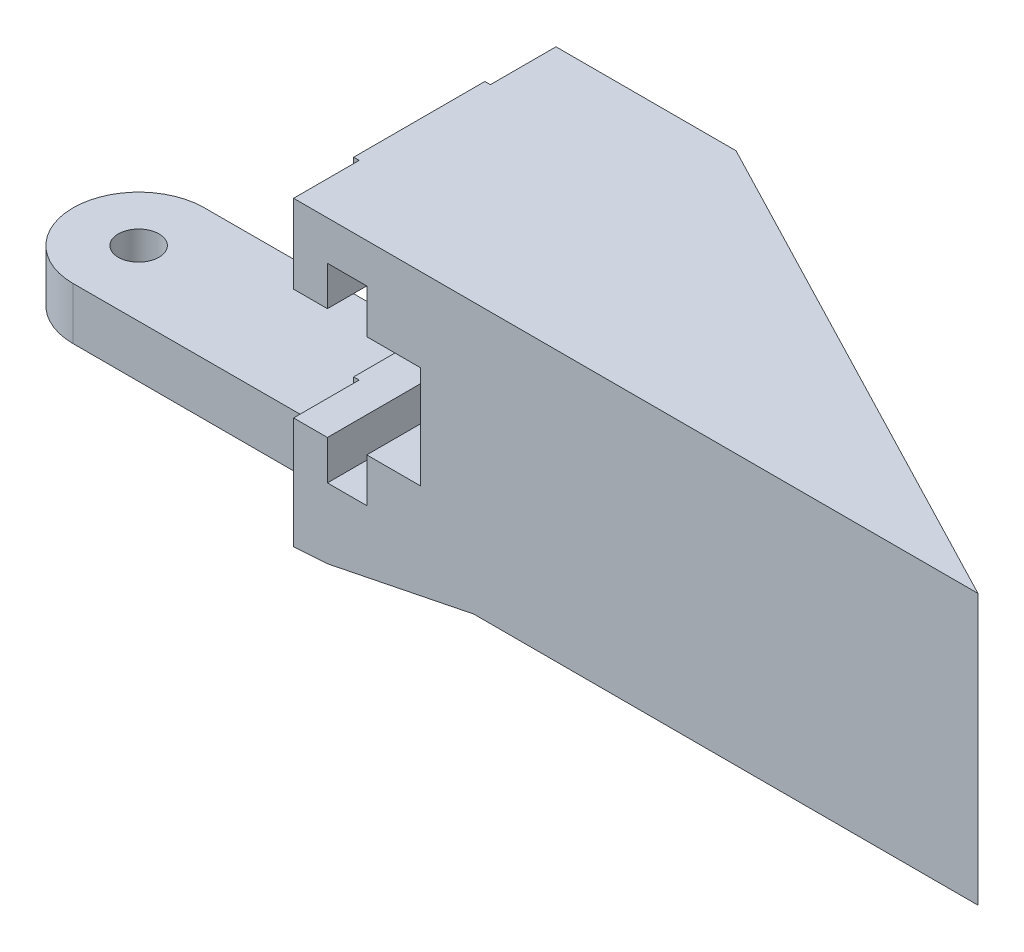
ISO-10303-21;
HEADER;
FILE_DESCRIPTION(('STEP AP214'),'2;1');
FILE_NAME('part.step','',(''),(''),'','','');
FILE_SCHEMA(('AUTOMOTIVE_DESIGN { 1 0 10303 214 1 1 1 1 }'));
ENDSEC;
DATA;
#1=APPLICATION_CONTEXT('core data for automotive mechanical design processes');
#2=APPLICATION_PROTOCOL_DEFINITION('international standard','automotive_design',2000,#1);
#3=PRODUCT_CONTEXT('',#1,'mechanical');
#4=PRODUCT('Part','Part','',(#3));
#5=PRODUCT_RELATED_PRODUCT_CATEGORY('part','',(#4));
#6=PRODUCT_DEFINITION_FORMATION('','',#4);
#7=PRODUCT_DEFINITION_CONTEXT('part definition',#1,'design');
#8=PRODUCT_DEFINITION('design','',#6,#7);
#9=PRODUCT_DEFINITION_SHAPE('','',#8);
#10=(LENGTH_UNIT() NAMED_UNIT(*) SI_UNIT(.MILLI.,.METRE.));
#11=(NAMED_UNIT(*) PLANE_ANGLE_UNIT() SI_UNIT($,.RADIAN.));
#12=(NAMED_UNIT(*) SI_UNIT($,.STERADIAN.) SOLID_ANGLE_UNIT());
#13=UNCERTAINTY_MEASURE_WITH_UNIT(LENGTH_MEASURE(1.E-05),#10,'distance_accuracy_value','');
#14=(GEOMETRIC_REPRESENTATION_CONTEXT(3) GLOBAL_UNCERTAINTY_ASSIGNED_CONTEXT((#13)) GLOBAL_UNIT_ASSIGNED_CONTEXT((#10,
#11,#12)) REPRESENTATION_CONTEXT('',''));
#15=CARTESIAN_POINT('',(0.,0.,0.));
#16=DIRECTION('',(0.,0.,1.));
#17=DIRECTION('',(1.,0.,0.));
#18=AXIS2_PLACEMENT_3D('',#15,#16,#17);
#19=CARTESIAN_POINT('',(-39.49001324769,-7.53608306718795,20.));
#20=DIRECTION('',(0.00136731456757834,-0.999999065225,0.));
#21=DIRECTION('',(0.999999065225,0.00136731456757834,0.));
#22=AXIS2_PLACEMENT_3D('',#19,#20,#21);
#23=PLANE('',#22);
#24=CARTESIAN_POINT('',(-34.49001324769,-7.5292464879594,10.));
#25=DIRECTION('',(0.00136731456757834,-0.999999065225,0.));
#26=DIRECTION('',(-0.999999065225,-0.00136731456757834,0.));
#27=AXIS2_PLACEMENT_3D('',#24,#25,#26);
#28=ELLIPSE('',#27,1.55000144890261,1.55);
#29=CARTESIAN_POINT('',(-36.04001324769,-7.53136582752025,10.));
#30=VERTEX_POINT('',#29);
#31=EDGE_CURVE('E281',#30,#30,#28,.T.);
#32=ORIENTED_EDGE('',*,*,#31,.T.);
#33=EDGE_LOOP('',(#32));
#34=FACE_BOUND('',#33,.T.);
#35=DIRECTION('',(-0.999999065225,-0.00136731456757834,0.));
#36=VECTOR('',#35,1.);
#37=CARTESIAN_POINT('',(-39.49001324769,-7.53608306718795,5.));
#38=LINE('',#37,#36);
#39=CARTESIAN_POINT('',(-13.1003043144092,-7.49999999999978,5.));
#40=VERTEX_POINT('',#39);
#41=CARTESIAN_POINT('',(-34.49001324769,-7.52924648795939,5.));
#42=VERTEX_POINT('',#41);
#43=EDGE_CURVE('E291',#40,#42,#38,.T.);
#44=ORIENTED_EDGE('',*,*,#43,.T.);
#45=CARTESIAN_POINT('',(-34.49001324769,-7.5292464879594,10.));
#46=DIRECTION('',(0.00136731456757834,-0.999999065225,0.));
#47=DIRECTION('',(-0.999999065225,-0.00136731456757834,0.));
#48=AXIS2_PLACEMENT_3D('',#45,#46,#47);
#49=ELLIPSE('',#48,5.00000467387937,5.);
#50=CARTESIAN_POINT('',(-34.49001324769,-7.52924648795939,15.));
#51=VERTEX_POINT('',#50);
#52=EDGE_CURVE('E270',#51,#42,#49,.T.);
#53=ORIENTED_EDGE('',*,*,#52,.F.);
#54=DIRECTION('',(0.999999065225,0.00136731456757834,0.));
#55=VECTOR('',#54,1.);
#56=CARTESIAN_POINT('',(-39.49001324769,-7.53608306718795,15.));
#57=LINE('',#56,#55);
#58=CARTESIAN_POINT('',(-13.1003043144092,-7.49999999999978,15.));
#59=VERTEX_POINT('',#58);
#60=EDGE_CURVE('E320',#51,#59,#57,.T.);
#61=ORIENTED_EDGE('',*,*,#60,.T.);
#62=DIRECTION('',(0.,0.,-1.));
#63=VECTOR('',#62,1.);
#64=CARTESIAN_POINT('',(-13.1003043144092,-7.49999999999978,20.));
#65=LINE('',#64,#63);
#66=EDGE_CURVE('E475',#59,#40,#65,.T.);
#67=ORIENTED_EDGE('',*,*,#66,.T.);
#68=EDGE_LOOP('',(#44,#53,#61,#67));
#69=FACE_BOUND('',#68,.T.);
#70=ADVANCED_FACE('F87',(#34,#69),#23,.F.);
#71=CARTESIAN_POINT('',(-12.6786659876891,-11.5000000000002,20.));
#72=DIRECTION('',(0.,1.,0.));
#73=DIRECTION('',(0.,0.,1.));
#74=AXIS2_PLACEMENT_3D('',#71,#72,#73);
#75=PLANE('',#74);
#76=CARTESIAN_POINT('',(-34.49001324769,-11.5000000000002,10.));
#77=DIRECTION('',(0.,1.,0.));
#78=DIRECTION('',(0.,0.,1.));
#79=AXIS2_PLACEMENT_3D('',#76,#77,#78);
#80=CIRCLE('',#79,1.55);
#81=CARTESIAN_POINT('',(-34.49001324769,-11.5000000000002,11.55));
#82=VERTEX_POINT('',#81);
#83=EDGE_CURVE('E535',#82,#82,#80,.T.);
#84=ORIENTED_EDGE('',*,*,#83,.T.);
#85=EDGE_LOOP('',(#84));
#86=FACE_BOUND('',#85,.T.);
#87=CARTESIAN_POINT('',(-34.49001324769,-11.5000000000002,10.));
#88=DIRECTION('',(0.,-1.,0.));
#89=DIRECTION('',(0.,0.,-1.));
#90=AXIS2_PLACEMENT_3D('',#87,#88,#89);
#91=CIRCLE('',#90,5.);
#92=CARTESIAN_POINT('',(-34.49001324769,-11.5000000000002,15.));
#93=VERTEX_POINT('',#92);
#94=CARTESIAN_POINT('',(-34.49001324769,-11.5000000000002,5.));
#95=VERTEX_POINT('',#94);
#96=EDGE_CURVE('E91',#93,#95,#91,.T.);
#97=ORIENTED_EDGE('',*,*,#96,.T.);
#98=DIRECTION('',(1.,0.,0.));
#99=VECTOR('',#98,1.);
#100=CARTESIAN_POINT('',(-12.6786659876891,-11.5000000000002,5.));
#101=LINE('',#100,#99);
#102=CARTESIAN_POINT('',(-12.6786659876891,-11.5000000000002,5.));
#103=VERTEX_POINT('',#102);
#104=EDGE_CURVE('E277',#95,#103,#101,.T.);
#105=ORIENTED_EDGE('',*,*,#104,.T.);
#106=DIRECTION('',(0.,0.,-1.));
#107=VECTOR('',#106,1.);
#108=CARTESIAN_POINT('',(-12.6786659876891,-11.5000000000002,20.));
#109=LINE('',#108,#107);
#110=CARTESIAN_POINT('',(-12.6786659876891,-11.5000000000002,15.));
#111=VERTEX_POINT('',#110);
#112=EDGE_CURVE('E470',#111,#103,#109,.T.);
#113=ORIENTED_EDGE('',*,*,#112,.F.);
#114=DIRECTION('',(-1.,0.,0.));
#115=VECTOR('',#114,1.);
#116=CARTESIAN_POINT('',(-12.6786659876891,-11.5000000000002,15.));
#117=LINE('',#116,#115);
#118=EDGE_CURVE('E279',#111,#93,#117,.T.);
#119=ORIENTED_EDGE('',*,*,#118,.T.);
#120=EDGE_LOOP('',(#97,#105,#113,#119));
#121=FACE_BOUND('',#120,.T.);
#122=ADVANCED_FACE('F274',(#86,#121),#75,.F.);
#123=CARTESIAN_POINT('',(-12.6786659876891,11.5000000000002,5.));
#124=DIRECTION('',(0.,0.,1.));
#125=DIRECTION('',(1.,0.,0.));
#126=AXIS2_PLACEMENT_3D('',#123,#124,#125);
#127=PLANE('',#126);
#128=DIRECTION('',(0.,-1.,0.));
#129=VECTOR('',#128,1.);
#130=CARTESIAN_POINT('',(-34.49001324769,11.5000000000002,5.));
#131=LINE('',#130,#129);
#132=EDGE_CURVE('E12',#42,#95,#131,.T.);
#133=ORIENTED_EDGE('',*,*,#132,.F.);
#134=ORIENTED_EDGE('',*,*,#43,.F.);
#135=DIRECTION('',(0.,-1.,0.));
#136=VECTOR('',#135,1.);
#137=CARTESIAN_POINT('',(-13.1003043144092,-7.49999999999978,5.));
#138=LINE('',#137,#136);
#139=CARTESIAN_POINT('',(-13.1003043144092,-2.99999999999977,5.));
#140=VERTEX_POINT('',#139);
#141=EDGE_CURVE('E296',#140,#40,#138,.T.);
#142=ORIENTED_EDGE('',*,*,#141,.F.);
#143=DIRECTION('',(-1.,0.,0.));
#144=VECTOR('',#143,1.);
#145=CARTESIAN_POINT('',(-13.1003043144092,-2.99999999999977,5.));
#146=LINE('',#145,#144);
#147=CARTESIAN_POINT('',(-12.6786659876891,-2.99999999999976,5.));
#148=VERTEX_POINT('',#147);
#149=EDGE_CURVE('E306',#148,#140,#146,.T.);
#150=ORIENTED_EDGE('',*,*,#149,.F.);
#151=DIRECTION('',(0.,-1.,0.));
#152=VECTOR('',#151,1.);
#153=CARTESIAN_POINT('',(-12.6786659876891,11.5000000000002,5.));
#154=LINE('',#153,#152);
#155=EDGE_CURVE('E288',#148,#103,#154,.T.);
#156=ORIENTED_EDGE('',*,*,#155,.T.);
#157=ORIENTED_EDGE('',*,*,#104,.F.);
#158=EDGE_LOOP('',(#133,#134,#142,#150,#156,#157));
#159=FACE_BOUND('',#158,.T.);
#160=ADVANCED_FACE('F286',(#159),#127,.F.);
#161=CARTESIAN_POINT('',(-13.1003043144223,5.50000000000023,20.));
#162=DIRECTION('',(1.,0.,0.));
#163=DIRECTION('',(0.,0.,-1.));
#164=AXIS2_PLACEMENT_3D('',#161,#162,#163);
#165=PLANE('',#164);
#166=DIRECTION('',(0.,0.,-1.));
#167=VECTOR('',#166,1.);
#168=CARTESIAN_POINT('',(-13.1003043144223,5.50000000000023,20.));
#169=LINE('',#168,#167);
#170=CARTESIAN_POINT('',(-13.1003043144223,5.50000000000023,15.));
#171=VERTEX_POINT('',#170);
#172=CARTESIAN_POINT('',(-13.1003043144223,5.50000000000023,5.));
#173=VERTEX_POINT('',#172);
#174=EDGE_CURVE('E523',#171,#173,#169,.T.);
#175=ORIENTED_EDGE('',*,*,#174,.F.);
#176=DIRECTION('',(0.,1.,0.));
#177=VECTOR('',#176,1.);
#178=CARTESIAN_POINT('',(-13.1003043144223,5.50000000000023,15.));
#179=LINE('',#178,#177);
#180=CARTESIAN_POINT('',(-13.1003043144223,11.5000000000002,15.));
#181=VERTEX_POINT('',#180);
#182=EDGE_CURVE('E335',#171,#181,#179,.T.);
#183=ORIENTED_EDGE('',*,*,#182,.T.);
#184=DIRECTION('',(0.,0.,-1.));
#185=VECTOR('',#184,1.);
#186=CARTESIAN_POINT('',(-13.1003043144223,11.5000000000002,20.));
#187=LINE('',#186,#185);
#188=CARTESIAN_POINT('',(-13.1003043144223,11.5000000000002,5.));
#189=VERTEX_POINT('',#188);
#190=EDGE_CURVE('E408',#181,#189,#187,.T.);
#191=ORIENTED_EDGE('',*,*,#190,.T.);
#192=DIRECTION('',(0.,-1.,0.));
#193=VECTOR('',#192,1.);
#194=CARTESIAN_POINT('',(-13.1003043144223,5.50000000000023,5.));
#195=LINE('',#194,#193);
#196=EDGE_CURVE('E314',#189,#173,#195,.T.);
#197=ORIENTED_EDGE('',*,*,#196,.T.);
#198=EDGE_LOOP('',(#175,#183,#191,#197));
#199=FACE_BOUND('',#198,.T.);
#200=ADVANCED_FACE('F89',(#199),#165,.F.);
#201=CARTESIAN_POINT('',(-10.1003043144092,5.50000000000023,20.));
#202=DIRECTION('',(0.,1.,0.));
#203=DIRECTION('',(0.,0.,1.));
#204=AXIS2_PLACEMENT_3D('',#201,#202,#203);
#205=PLANE('',#204);
#206=DIRECTION('',(1.,0.,0.));
#207=VECTOR('',#206,1.);
#208=CARTESIAN_POINT('',(-10.1003043144092,5.50000000000023,20.));
#209=LINE('',#208,#207);
#210=CARTESIAN_POINT('',(-12.6786659876891,5.50000000000023,20.));
#211=VERTEX_POINT('',#210);
#212=CARTESIAN_POINT('',(-10.1003043144092,5.50000000000023,20.));
#213=VERTEX_POINT('',#212);
#214=EDGE_CURVE('E352',#211,#213,#209,.T.);
#215=ORIENTED_EDGE('',*,*,#214,.F.);
#216=DIRECTION('',(0.,0.,-1.));
#217=VECTOR('',#216,1.);
#218=CARTESIAN_POINT('',(-12.6786659876891,5.50000000000023,20.));
#219=LINE('',#218,#217);
#220=CARTESIAN_POINT('',(-12.6786659876891,5.50000000000023,15.));
#221=VERTEX_POINT('',#220);
#222=EDGE_CURVE('E292',#211,#221,#219,.T.);
#223=ORIENTED_EDGE('',*,*,#222,.T.);
#224=DIRECTION('',(-1.,0.,0.));
#225=VECTOR('',#224,1.);
#226=CARTESIAN_POINT('',(-10.1003043144092,5.50000000000023,15.));
#227=LINE('',#226,#225);
#228=EDGE_CURVE('E331',#221,#171,#227,.T.);
#229=ORIENTED_EDGE('',*,*,#228,.T.);
#230=ORIENTED_EDGE('',*,*,#174,.T.);
#231=DIRECTION('',(1.,0.,0.));
#232=VECTOR('',#231,1.);
#233=CARTESIAN_POINT('',(-10.1003043144092,5.50000000000023,5.));
#234=LINE('',#233,#232);
#235=CARTESIAN_POINT('',(-12.6786659876891,5.50000000000023,5.));
#236=VERTEX_POINT('',#235);
#237=EDGE_CURVE('E310',#173,#236,#234,.T.);
#238=ORIENTED_EDGE('',*,*,#237,.T.);
#239=DIRECTION('',(0.,0.,-1.));
#240=VECTOR('',#239,1.);
#241=CARTESIAN_POINT('',(-12.6786659876891,5.50000000000023,20.));
#242=LINE('',#241,#240);
#243=CARTESIAN_POINT('',(-12.6786659876891,5.50000000000023,0.));
#244=VERTEX_POINT('',#243);
#245=EDGE_CURVE('E588',#236,#244,#242,.T.);
#246=ORIENTED_EDGE('',*,*,#245,.T.);
#247=DIRECTION('',(1.,0.,0.));
#248=VECTOR('',#247,1.);
#249=CARTESIAN_POINT('',(-10.1003043144092,5.50000000000023,0.));
#250=LINE('',#249,#248);
#251=CARTESIAN_POINT('',(-10.1003043144092,5.50000000000023,0.));
#252=VERTEX_POINT('',#251);
#253=EDGE_CURVE('E351',#244,#252,#250,.T.);
#254=ORIENTED_EDGE('',*,*,#253,.T.);
#255=DIRECTION('',(0.,0.,-1.));
#256=VECTOR('',#255,1.);
#257=CARTESIAN_POINT('',(-10.1003043144092,5.50000000000023,20.));
#258=LINE('',#257,#256);
#259=EDGE_CURVE('E519',#213,#252,#258,.T.);
#260=ORIENTED_EDGE('',*,*,#259,.F.);
#261=EDGE_LOOP('',(#215,#223,#229,#230,#238,#246,#254,#260));
#262=FACE_BOUND('',#261,.T.);
#263=ADVANCED_FACE('F785',(#262),#205,.F.);
#264=CARTESIAN_POINT('',(-10.1003043144092,8.50000000000023,20.));
#265=DIRECTION('',(-1.,0.,0.));
#266=DIRECTION('',(0.,0.,1.));
#267=AXIS2_PLACEMENT_3D('',#264,#265,#266);
#268=PLANE('',#267);
#269=DIRECTION('',(0.,1.,0.));
#270=VECTOR('',#269,1.);
#271=CARTESIAN_POINT('',(-10.1003043144092,8.50000000000023,0.));
#272=LINE('',#271,#270);
#273=CARTESIAN_POINT('',(-10.1003043144092,8.50000000000023,0.));
#274=VERTEX_POINT('',#273);
#275=EDGE_CURVE('E411',#252,#274,#272,.T.);
#276=ORIENTED_EDGE('',*,*,#275,.T.);
#277=DIRECTION('',(0.,0.,-1.));
#278=VECTOR('',#277,1.);
#279=CARTESIAN_POINT('',(-10.1003043144092,8.50000000000023,20.));
#280=LINE('',#279,#278);
#281=CARTESIAN_POINT('',(-10.1003043144092,8.50000000000023,20.));
#282=VERTEX_POINT('',#281);
#283=EDGE_CURVE('E515',#282,#274,#280,.T.);
#284=ORIENTED_EDGE('',*,*,#283,.F.);
#285=DIRECTION('',(0.,1.,0.));
#286=VECTOR('',#285,1.);
#287=CARTESIAN_POINT('',(-10.1003043144092,8.50000000000023,20.));
#288=LINE('',#287,#286);
#289=EDGE_CURVE('E355',#213,#282,#288,.T.);
#290=ORIENTED_EDGE('',*,*,#289,.F.);
#291=ORIENTED_EDGE('',*,*,#259,.T.);
#292=EDGE_LOOP('',(#276,#284,#290,#291));
#293=FACE_BOUND('',#292,.T.);
#294=ADVANCED_FACE('F789',(#293),#268,.F.);
#295=CARTESIAN_POINT('',(-7.10030431440922,8.50000000000023,20.));
#296=DIRECTION('',(0.,1.,0.));
#297=DIRECTION('',(0.,0.,1.));
#298=AXIS2_PLACEMENT_3D('',#295,#296,#297);
#299=PLANE('',#298);
#300=DIRECTION('',(1.,0.,0.));
#301=VECTOR('',#300,1.);
#302=CARTESIAN_POINT('',(-7.10030431440922,8.50000000000023,0.));
#303=LINE('',#302,#301);
#304=CARTESIAN_POINT('',(-7.10030431440922,8.50000000000023,0.));
#305=VERTEX_POINT('',#304);
#306=EDGE_CURVE('E414',#274,#305,#303,.T.);
#307=ORIENTED_EDGE('',*,*,#306,.T.);
#308=DIRECTION('',(0.,0.,-1.));
#309=VECTOR('',#308,1.);
#310=CARTESIAN_POINT('',(-7.10030431440922,8.50000000000023,20.));
#311=LINE('',#310,#309);
#312=CARTESIAN_POINT('',(-7.10030431440922,8.50000000000023,20.));
#313=VERTEX_POINT('',#312);
#314=EDGE_CURVE('E511',#313,#305,#311,.T.);
#315=ORIENTED_EDGE('',*,*,#314,.F.);
#316=DIRECTION('',(1.,0.,0.));
#317=VECTOR('',#316,1.);
#318=CARTESIAN_POINT('',(-7.10030431440922,8.50000000000023,20.));
#319=LINE('',#318,#317);
#320=EDGE_CURVE('E359',#282,#313,#319,.T.);
#321=ORIENTED_EDGE('',*,*,#320,.F.);
#322=ORIENTED_EDGE('',*,*,#283,.T.);
#323=EDGE_LOOP('',(#307,#315,#321,#322));
#324=FACE_BOUND('',#323,.T.);
#325=ADVANCED_FACE('F871',(#324),#299,.F.);
#326=CARTESIAN_POINT('',(-7.10030431440922,5.15000000000023,20.));
#327=DIRECTION('',(1.,0.,0.));
#328=DIRECTION('',(0.,0.,-1.));
#329=AXIS2_PLACEMENT_3D('',#326,#327,#328);
#330=PLANE('',#329);
#331=DIRECTION('',(0.,-1.,0.));
#332=VECTOR('',#331,1.);
#333=CARTESIAN_POINT('',(-7.10030431440922,5.15000000000023,0.));
#334=LINE('',#333,#332);
#335=CARTESIAN_POINT('',(-7.10030431440922,5.15000000000023,0.));
#336=VERTEX_POINT('',#335);
#337=EDGE_CURVE('E417',#305,#336,#334,.T.);
#338=ORIENTED_EDGE('',*,*,#337,.T.);
#339=DIRECTION('',(0.,0.,-1.));
#340=VECTOR('',#339,1.);
#341=CARTESIAN_POINT('',(-7.10030431440922,5.15000000000023,20.));
#342=LINE('',#341,#340);
#343=CARTESIAN_POINT('',(-7.10030431440922,5.15000000000023,20.));
#344=VERTEX_POINT('',#343);
#345=EDGE_CURVE('E507',#344,#336,#342,.T.);
#346=ORIENTED_EDGE('',*,*,#345,.F.);
#347=DIRECTION('',(0.,-1.,0.));
#348=VECTOR('',#347,1.);
#349=CARTESIAN_POINT('',(-7.10030431440922,5.15000000000023,20.));
#350=LINE('',#349,#348);
#351=EDGE_CURVE('E362',#313,#344,#350,.T.);
#352=ORIENTED_EDGE('',*,*,#351,.F.);
#353=ORIENTED_EDGE('',*,*,#314,.T.);
#354=EDGE_LOOP('',(#338,#346,#352,#353));
#355=FACE_BOUND('',#354,.T.);
#356=ADVANCED_FACE('F884',(#355),#330,.F.);
#357=CARTESIAN_POINT('',(-3.00030431440922,5.15000000000023,20.));
#358=DIRECTION('',(0.,1.,0.));
#359=DIRECTION('',(0.,0.,1.));
#360=AXIS2_PLACEMENT_3D('',#357,#358,#359);
#361=PLANE('',#360);
#362=DIRECTION('',(1.,0.,0.));
#363=VECTOR('',#362,1.);
#364=CARTESIAN_POINT('',(-3.00030431440922,5.15000000000023,0.));
#365=LINE('',#364,#363);
#366=CARTESIAN_POINT('',(-3.00030431440922,5.15000000000023,0.));
#367=VERTEX_POINT('',#366);
#368=EDGE_CURVE('E420',#336,#367,#365,.T.);
#369=ORIENTED_EDGE('',*,*,#368,.T.);
#370=DIRECTION('',(0.,0.,-1.));
#371=VECTOR('',#370,1.);
#372=CARTESIAN_POINT('',(-3.00030431440922,5.15000000000023,20.));
#373=LINE('',#372,#371);
#374=CARTESIAN_POINT('',(-3.00030431440922,5.15000000000023,20.));
#375=VERTEX_POINT('',#374);
#376=EDGE_CURVE('E503',#375,#367,#373,.T.);
#377=ORIENTED_EDGE('',*,*,#376,.F.);
#378=DIRECTION('',(1.,0.,0.));
#379=VECTOR('',#378,1.);
#380=CARTESIAN_POINT('',(-3.00030431440922,5.15000000000023,20.));
#381=LINE('',#380,#379);
#382=EDGE_CURVE('E365',#344,#375,#381,.T.);
#383=ORIENTED_EDGE('',*,*,#382,.F.);
#384=ORIENTED_EDGE('',*,*,#345,.T.);
#385=EDGE_LOOP('',(#369,#377,#383,#384));
#386=FACE_BOUND('',#385,.T.);
#387=ADVANCED_FACE('F887',(#386),#361,.F.);
#388=CARTESIAN_POINT('',(-3.00030431440922,-2.64999999999977,20.));
#389=DIRECTION('',(1.,0.,0.));
#390=DIRECTION('',(0.,0.,-1.));
#391=AXIS2_PLACEMENT_3D('',#388,#389,#390);
#392=PLANE('',#391);
#393=DIRECTION('',(0.,-1.,0.));
#394=VECTOR('',#393,1.);
#395=CARTESIAN_POINT('',(-3.00030431440922,-2.64999999999977,0.));
#396=LINE('',#395,#394);
#397=CARTESIAN_POINT('',(-3.00030431440922,-2.64999999999977,0.));
#398=VERTEX_POINT('',#397);
#399=EDGE_CURVE('E423',#367,#398,#396,.T.);
#400=ORIENTED_EDGE('',*,*,#399,.T.);
#401=DIRECTION('',(0.,0.,-1.));
#402=VECTOR('',#401,1.);
#403=CARTESIAN_POINT('',(-3.00030431440922,-2.64999999999977,20.));
#404=LINE('',#403,#402);
#405=CARTESIAN_POINT('',(-3.00030431440922,-2.64999999999977,20.));
#406=VERTEX_POINT('',#405);
#407=EDGE_CURVE('E499',#406,#398,#404,.T.);
#408=ORIENTED_EDGE('',*,*,#407,.F.);
#409=DIRECTION('',(0.,-1.,0.));
#410=VECTOR('',#409,1.);
#411=CARTESIAN_POINT('',(-3.00030431440922,-2.64999999999977,20.));
#412=LINE('',#411,#410);
#413=EDGE_CURVE('E368',#375,#406,#412,.T.);
#414=ORIENTED_EDGE('',*,*,#413,.F.);
#415=ORIENTED_EDGE('',*,*,#376,.T.);
#416=EDGE_LOOP('',(#400,#408,#414,#415));
#417=FACE_BOUND('',#416,.T.);
#418=ADVANCED_FACE('F892',(#417),#392,.F.);
#419=CARTESIAN_POINT('',(-7.10030431440923,-2.64999999999977,20.));
#420=DIRECTION('',(0.,-1.,0.));
#421=DIRECTION('',(0.,0.,-1.));
#422=AXIS2_PLACEMENT_3D('',#419,#420,#421);
#423=PLANE('',#422);
#424=DIRECTION('',(-1.,0.,0.));
#425=VECTOR('',#424,1.);
#426=CARTESIAN_POINT('',(-7.10030431440923,-2.64999999999977,0.));
#427=LINE('',#426,#425);
#428=CARTESIAN_POINT('',(-7.10030431440923,-2.64999999999977,0.));
#429=VERTEX_POINT('',#428);
#430=EDGE_CURVE('E426',#398,#429,#427,.T.);
#431=ORIENTED_EDGE('',*,*,#430,.T.);
#432=DIRECTION('',(0.,0.,-1.));
#433=VECTOR('',#432,1.);
#434=CARTESIAN_POINT('',(-7.10030431440923,-2.64999999999977,20.));
#435=LINE('',#434,#433);
#436=CARTESIAN_POINT('',(-7.10030431440923,-2.64999999999977,20.));
#437=VERTEX_POINT('',#436);
#438=EDGE_CURVE('E495',#437,#429,#435,.T.);
#439=ORIENTED_EDGE('',*,*,#438,.F.);
#440=DIRECTION('',(-1.,0.,0.));
#441=VECTOR('',#440,1.);
#442=CARTESIAN_POINT('',(-7.10030431440923,-2.64999999999977,20.));
#443=LINE('',#442,#441);
#444=EDGE_CURVE('E371',#406,#437,#443,.T.);
#445=ORIENTED_EDGE('',*,*,#444,.F.);
#446=ORIENTED_EDGE('',*,*,#407,.T.);
#447=EDGE_LOOP('',(#431,#439,#445,#446));
#448=FACE_BOUND('',#447,.T.);
#449=ADVANCED_FACE('F898',(#448),#423,.F.);
#450=CARTESIAN_POINT('',(-7.10030431440923,-5.99999999999977,20.));
#451=DIRECTION('',(1.,0.,0.));
#452=DIRECTION('',(0.,0.,-1.));
#453=AXIS2_PLACEMENT_3D('',#450,#451,#452);
#454=PLANE('',#453);
#455=DIRECTION('',(0.,-1.,0.));
#456=VECTOR('',#455,1.);
#457=CARTESIAN_POINT('',(-7.10030431440923,-5.99999999999977,0.));
#458=LINE('',#457,#456);
#459=CARTESIAN_POINT('',(-7.10030431440923,-5.99999999999977,0.));
#460=VERTEX_POINT('',#459);
#461=EDGE_CURVE('E429',#429,#460,#458,.T.);
#462=ORIENTED_EDGE('',*,*,#461,.T.);
#463=DIRECTION('',(0.,0.,-1.));
#464=VECTOR('',#463,1.);
#465=CARTESIAN_POINT('',(-7.10030431440923,-5.99999999999977,20.));
#466=LINE('',#465,#464);
#467=CARTESIAN_POINT('',(-7.10030431440923,-5.99999999999977,20.));
#468=VERTEX_POINT('',#467);
#469=EDGE_CURVE('E491',#468,#460,#466,.T.);
#470=ORIENTED_EDGE('',*,*,#469,.F.);
#471=DIRECTION('',(0.,-1.,0.));
#472=VECTOR('',#471,1.);
#473=CARTESIAN_POINT('',(-7.10030431440923,-5.99999999999977,20.));
#474=LINE('',#473,#472);
#475=EDGE_CURVE('E374',#437,#468,#474,.T.);
#476=ORIENTED_EDGE('',*,*,#475,.F.);
#477=ORIENTED_EDGE('',*,*,#438,.T.);
#478=EDGE_LOOP('',(#462,#470,#476,#477));
#479=FACE_BOUND('',#478,.T.);
#480=ADVANCED_FACE('F902',(#479),#454,.F.);
#481=CARTESIAN_POINT('',(-10.1003043144092,-5.99999999999977,20.));
#482=DIRECTION('',(0.,-1.,0.));
#483=DIRECTION('',(0.,0.,-1.));
#484=AXIS2_PLACEMENT_3D('',#481,#482,#483);
#485=PLANE('',#484);
#486=DIRECTION('',(-1.,0.,0.));
#487=VECTOR('',#486,1.);
#488=CARTESIAN_POINT('',(-10.1003043144092,-5.99999999999977,0.));
#489=LINE('',#488,#487);
#490=CARTESIAN_POINT('',(-10.1003043144092,-5.99999999999977,0.));
#491=VERTEX_POINT('',#490);
#492=EDGE_CURVE('E432',#460,#491,#489,.T.);
#493=ORIENTED_EDGE('',*,*,#492,.T.);
#494=DIRECTION('',(0.,0.,-1.));
#495=VECTOR('',#494,1.);
#496=CARTESIAN_POINT('',(-10.1003043144092,-5.99999999999977,20.));
#497=LINE('',#496,#495);
#498=CARTESIAN_POINT('',(-10.1003043144092,-5.99999999999977,20.));
#499=VERTEX_POINT('',#498);
#500=EDGE_CURVE('E487',#499,#491,#497,.T.);
#501=ORIENTED_EDGE('',*,*,#500,.F.);
#502=DIRECTION('',(-1.,0.,0.));
#503=VECTOR('',#502,1.);
#504=CARTESIAN_POINT('',(-10.1003043144092,-5.99999999999977,20.));
#505=LINE('',#504,#503);
#506=EDGE_CURVE('E377',#468,#499,#505,.T.);
#507=ORIENTED_EDGE('',*,*,#506,.F.);
#508=ORIENTED_EDGE('',*,*,#469,.T.);
#509=EDGE_LOOP('',(#493,#501,#507,#508));
#510=FACE_BOUND('',#509,.T.);
#511=ADVANCED_FACE('F904',(#510),#485,.F.);
#512=CARTESIAN_POINT('',(-10.1003043144092,-2.99999999999977,20.));
#513=DIRECTION('',(-1.,0.,0.));
#514=DIRECTION('',(0.,0.,1.));
#515=AXIS2_PLACEMENT_3D('',#512,#513,#514);
#516=PLANE('',#515);
#517=DIRECTION('',(0.,1.,0.));
#518=VECTOR('',#517,1.);
#519=CARTESIAN_POINT('',(-10.1003043144092,-2.99999999999977,0.));
#520=LINE('',#519,#518);
#521=CARTESIAN_POINT('',(-10.1003043144092,-2.99999999999977,0.));
#522=VERTEX_POINT('',#521);
#523=EDGE_CURVE('E435',#491,#522,#520,.T.);
#524=ORIENTED_EDGE('',*,*,#523,.T.);
#525=DIRECTION('',(0.,0.,-1.));
#526=VECTOR('',#525,1.);
#527=CARTESIAN_POINT('',(-10.1003043144092,-2.99999999999977,20.));
#528=LINE('',#527,#526);
#529=CARTESIAN_POINT('',(-10.1003043144092,-2.99999999999977,20.));
#530=VERTEX_POINT('',#529);
#531=EDGE_CURVE('E483',#530,#522,#528,.T.);
#532=ORIENTED_EDGE('',*,*,#531,.F.);
#533=DIRECTION('',(0.,1.,0.));
#534=VECTOR('',#533,1.);
#535=CARTESIAN_POINT('',(-10.1003043144092,-2.99999999999977,20.));
#536=LINE('',#535,#534);
#537=EDGE_CURVE('E380',#499,#530,#536,.T.);
#538=ORIENTED_EDGE('',*,*,#537,.F.);
#539=ORIENTED_EDGE('',*,*,#500,.T.);
#540=EDGE_LOOP('',(#524,#532,#538,#539));
#541=FACE_BOUND('',#540,.T.);
#542=ADVANCED_FACE('F608',(#541),#516,.F.);
#543=CARTESIAN_POINT('',(-13.1003043144092,-2.99999999999977,20.));
#544=DIRECTION('',(0.,-1.,0.));
#545=DIRECTION('',(0.,0.,-1.));
#546=AXIS2_PLACEMENT_3D('',#543,#544,#545);
#547=PLANE('',#546);
#548=DIRECTION('',(1.,0.,0.));
#549=VECTOR('',#548,1.);
#550=CARTESIAN_POINT('',(-13.1003043144092,-2.99999999999977,15.));
#551=LINE('',#550,#549);
#552=CARTESIAN_POINT('',(-13.1003043144092,-2.99999999999977,15.));
#553=VERTEX_POINT('',#552);
#554=CARTESIAN_POINT('',(-12.6786659876891,-2.99999999999976,15.));
#555=VERTEX_POINT('',#554);
#556=EDGE_CURVE('E327',#553,#555,#551,.T.);
#557=ORIENTED_EDGE('',*,*,#556,.T.);
#558=DIRECTION('',(0.,0.,1.));
#559=VECTOR('',#558,1.);
#560=CARTESIAN_POINT('',(-12.6786659876891,-2.99999999999977,20.));
#561=LINE('',#560,#559);
#562=CARTESIAN_POINT('',(-12.6786659876891,-2.99999999999976,20.));
#563=VERTEX_POINT('',#562);
#564=EDGE_CURVE('E299',#555,#563,#561,.T.);
#565=ORIENTED_EDGE('',*,*,#564,.T.);
#566=DIRECTION('',(-1.,0.,0.));
#567=VECTOR('',#566,1.);
#568=CARTESIAN_POINT('',(-13.1003043144092,-2.99999999999977,20.));
#569=LINE('',#568,#567);
#570=EDGE_CURVE('E383',#530,#563,#569,.T.);
#571=ORIENTED_EDGE('',*,*,#570,.F.);
#572=ORIENTED_EDGE('',*,*,#531,.T.);
#573=DIRECTION('',(-1.,0.,0.));
#574=VECTOR('',#573,1.);
#575=CARTESIAN_POINT('',(-13.1003043144092,-2.99999999999977,0.));
#576=LINE('',#575,#574);
#577=CARTESIAN_POINT('',(-12.6786659876891,-2.99999999999977,0.));
#578=VERTEX_POINT('',#577);
#579=EDGE_CURVE('E438',#522,#578,#576,.T.);
#580=ORIENTED_EDGE('',*,*,#579,.T.);
#581=DIRECTION('',(0.,0.,1.));
#582=VECTOR('',#581,1.);
#583=CARTESIAN_POINT('',(-12.6786659876891,-2.99999999999977,20.));
#584=LINE('',#583,#582);
#585=EDGE_CURVE('E584',#578,#148,#584,.T.);
#586=ORIENTED_EDGE('',*,*,#585,.T.);
#587=ORIENTED_EDGE('',*,*,#149,.T.);
#588=DIRECTION('',(0.,0.,-1.));
#589=VECTOR('',#588,1.);
#590=CARTESIAN_POINT('',(-13.1003043144092,-2.99999999999977,20.));
#591=LINE('',#590,#589);
#592=EDGE_CURVE('E479',#553,#140,#591,.T.);
#593=ORIENTED_EDGE('',*,*,#592,.F.);
#594=EDGE_LOOP('',(#557,#565,#571,#572,#580,#586,#587,#593));
#595=FACE_BOUND('',#594,.T.);
#596=ADVANCED_FACE('F595',(#595),#547,.F.);
#597=CARTESIAN_POINT('',(-13.1003043144092,-7.49999999999978,20.));
#598=DIRECTION('',(1.,0.,0.));
#599=DIRECTION('',(0.,0.,-1.));
#600=AXIS2_PLACEMENT_3D('',#597,#598,#599);
#601=PLANE('',#600);
#602=ORIENTED_EDGE('',*,*,#66,.F.);
#603=DIRECTION('',(0.,1.,0.));
#604=VECTOR('',#603,1.);
#605=CARTESIAN_POINT('',(-13.1003043144092,-7.49999999999978,15.));
#606=LINE('',#605,#604);
#607=EDGE_CURVE('E323',#59,#553,#606,.T.);
#608=ORIENTED_EDGE('',*,*,#607,.T.);
#609=ORIENTED_EDGE('',*,*,#592,.T.);
#610=ORIENTED_EDGE('',*,*,#141,.T.);
#611=EDGE_LOOP('',(#602,#608,#609,#610));
#612=FACE_BOUND('',#611,.T.);
#613=ADVANCED_FACE('F634',(#612),#601,.F.);
#614=CARTESIAN_POINT('',(-10.0240029671808,-11.3230362015424,20.));
#615=DIRECTION('',(-0.066513870443531,0.997785500515327,0.));
#616=DIRECTION('',(-0.997785500515327,-0.066513870443531,0.));
#617=AXIS2_PLACEMENT_3D('',#614,#615,#616);
#618=PLANE('',#617);
#619=DIRECTION('',(0.997785500515327,0.066513870443531,0.));
#620=VECTOR('',#619,1.);
#621=CARTESIAN_POINT('',(-10.0240029671808,-11.3230362015424,0.));
#622=LINE('',#621,#620);
#623=CARTESIAN_POINT('',(-12.6786659876891,-11.5000000000002,0.));
#624=VERTEX_POINT('',#623);
#625=CARTESIAN_POINT('',(-10.0240029671808,-11.3230362015424,0.));
#626=VERTEX_POINT('',#625);
#627=EDGE_CURVE('E442',#624,#626,#622,.T.);
#628=ORIENTED_EDGE('',*,*,#627,.T.);
#629=DIRECTION('',(0.,0.,-1.));
#630=VECTOR('',#629,1.);
#631=CARTESIAN_POINT('',(-10.0240029671808,-11.3230362015424,20.));
#632=LINE('',#631,#630);
#633=CARTESIAN_POINT('',(-10.0240029671808,-11.3230362015424,20.));
#634=VERTEX_POINT('',#633);
#635=EDGE_CURVE('E466',#634,#626,#632,.T.);
#636=ORIENTED_EDGE('',*,*,#635,.F.);
#637=DIRECTION('',(0.997785500515327,0.066513870443531,0.));
#638=VECTOR('',#637,1.);
#639=CARTESIAN_POINT('',(-10.0240029671808,-11.3230362015424,20.));
#640=LINE('',#639,#638);
#641=CARTESIAN_POINT('',(-12.6786659876891,-11.5000000000002,20.));
#642=VERTEX_POINT('',#641);
#643=EDGE_CURVE('E387',#642,#634,#640,.T.);
#644=ORIENTED_EDGE('',*,*,#643,.F.);
#645=EDGE_CURVE('E471',#642,#111,#109,.T.);
#646=ORIENTED_EDGE('',*,*,#645,.T.);
#647=ORIENTED_EDGE('',*,*,#112,.T.);
#648=DIRECTION('',(0.,0.,-1.));
#649=VECTOR('',#648,1.);
#650=CARTESIAN_POINT('',(-12.6786659876891,-11.5000000000002,20.));
#651=LINE('',#650,#649);
#652=EDGE_CURVE('E563',#103,#624,#651,.T.);
#653=ORIENTED_EDGE('',*,*,#652,.T.);
#654=EDGE_LOOP('',(#628,#636,#644,#646,#647,#653));
#655=FACE_BOUND('',#654,.T.);
#656=ADVANCED_FACE('F621',(#655),#618,.F.);
#657=CARTESIAN_POINT('',(-10.0240029671808,-11.3230362015424,20.));
#658=DIRECTION('',(-0.198364556618553,0.980128309292985,0.));
#659=DIRECTION('',(-0.980128309292985,-0.198364556618553,0.));
#660=AXIS2_PLACEMENT_3D('',#657,#658,#659);
#661=PLANE('',#660);
#662=DIRECTION('',(0.980128309292985,0.198364556618553,0.));
#663=VECTOR('',#662,1.);
#664=CARTESIAN_POINT('',(-10.0240029671808,-11.3230362015424,0.));
#665=LINE('',#664,#663);
#666=CARTESIAN_POINT('',(-7.41631787187856,-10.7952764247601,0.));
#667=VERTEX_POINT('',#666);
#668=EDGE_CURVE('E445',#626,#667,#665,.T.);
#669=ORIENTED_EDGE('',*,*,#668,.T.);
#670=DIRECTION('',(0.,0.,-1.));
#671=VECTOR('',#670,1.);
#672=CARTESIAN_POINT('',(-7.41631787187856,-10.7952764247601,20.));
#673=LINE('',#672,#671);
#674=CARTESIAN_POINT('',(-7.41631787187856,-10.7952764247601,20.));
#675=VERTEX_POINT('',#674);
#676=EDGE_CURVE('E462',#675,#667,#673,.T.);
#677=ORIENTED_EDGE('',*,*,#676,.F.);
#678=DIRECTION('',(0.980128309292985,0.198364556618553,0.));
#679=VECTOR('',#678,1.);
#680=CARTESIAN_POINT('',(-10.0240029671808,-11.3230362015424,20.));
#681=LINE('',#680,#679);
#682=EDGE_CURVE('E390',#634,#675,#681,.T.);
#683=ORIENTED_EDGE('',*,*,#682,.F.);
#684=ORIENTED_EDGE('',*,*,#635,.T.);
#685=EDGE_LOOP('',(#669,#677,#683,#684));
#686=FACE_BOUND('',#685,.T.);
#687=ADVANCED_FACE('F641',(#686),#661,.F.);
#688=CARTESIAN_POINT('',(1.04430005646884,-9.08319270445873,20.));
#689=DIRECTION('',(-0.198339008821346,0.980133479470917,0.));
#690=DIRECTION('',(-0.980133479470917,-0.198339008821346,0.));
#691=AXIS2_PLACEMENT_3D('',#688,#689,#690);
#692=PLANE('',#691);
#693=DIRECTION('',(0.980133479470917,0.198339008821346,0.));
#694=VECTOR('',#693,1.);
#695=CARTESIAN_POINT('',(1.04430005646884,-9.08319270445873,0.));
#696=LINE('',#695,#694);
#697=CARTESIAN_POINT('',(1.04430005646884,-9.08319270445873,0.));
#698=VERTEX_POINT('',#697);
#699=EDGE_CURVE('E448',#667,#698,#696,.T.);
#700=ORIENTED_EDGE('',*,*,#699,.T.);
#701=DIRECTION('',(0.,0.,-1.));
#702=VECTOR('',#701,1.);
#703=CARTESIAN_POINT('',(1.04430005646884,-9.08319270445873,20.));
#704=LINE('',#703,#702);
#705=CARTESIAN_POINT('',(1.04430005646884,-9.08319270445873,20.));
#706=VERTEX_POINT('',#705);
#707=EDGE_CURVE('E458',#706,#698,#704,.T.);
#708=ORIENTED_EDGE('',*,*,#707,.F.);
#709=DIRECTION('',(0.980133479470917,0.198339008821346,0.));
#710=VECTOR('',#709,1.);
#711=CARTESIAN_POINT('',(1.04430005646884,-9.08319270445873,20.));
#712=LINE('',#711,#710);
#713=EDGE_CURVE('E393',#675,#706,#712,.T.);
#714=ORIENTED_EDGE('',*,*,#713,.F.);
#715=ORIENTED_EDGE('',*,*,#676,.T.);
#716=EDGE_LOOP('',(#700,#708,#714,#715));
#717=FACE_BOUND('',#716,.T.);
#718=ADVANCED_FACE('F653',(#717),#692,.F.);
#719=CARTESIAN_POINT('',(39.4900132476577,-9.08319270445872,20.));
#720=DIRECTION('',(0.,1.,0.));
#721=DIRECTION('',(-1.,0.,0.));
#722=AXIS2_PLACEMENT_3D('',#719,#720,#721);
#723=PLANE('',#722);
#724=ORIENTED_EDGE('',*,*,#707,.T.);
#725=DIRECTION('',(0.887139063573789,0.,0.46150220138307));
#726=VECTOR('',#725,1.);
#727=CARTESIAN_POINT('',(39.4900132476577,-9.08319270445872,20.));
#728=LINE('',#727,#726);
#729=CARTESIAN_POINT('',(39.4900132476577,-9.08319270445872,20.));
#730=VERTEX_POINT('',#729);
#731=EDGE_CURVE('E347',#698,#730,#728,.T.);
#732=ORIENTED_EDGE('',*,*,#731,.T.);
#733=DIRECTION('',(1.,0.,0.));
#734=VECTOR('',#733,1.);
#735=CARTESIAN_POINT('',(39.4900132476577,-9.08319270445872,20.));
#736=LINE('',#735,#734);
#737=EDGE_CURVE('E396',#706,#730,#736,.T.);
#738=ORIENTED_EDGE('',*,*,#737,.F.);
#739=EDGE_LOOP('',(#724,#732,#738));
#740=FACE_BOUND('',#739,.T.);
#741=ADVANCED_FACE('F657',(#740),#723,.F.);
#742=CARTESIAN_POINT('',(-13.1003043144223,11.5000000000002,20.));
#743=DIRECTION('',(0.,-1.,0.));
#744=DIRECTION('',(0.,0.,-1.));
#745=AXIS2_PLACEMENT_3D('',#742,#743,#744);
#746=PLANE('',#745);
#747=DIRECTION('',(1.,0.,0.));
#748=VECTOR('',#747,1.);
#749=CARTESIAN_POINT('',(-12.6786659876891,11.5000000000002,15.));
#750=LINE('',#749,#748);
#751=CARTESIAN_POINT('',(-12.6786659876891,11.5000000000002,15.));
#752=VERTEX_POINT('',#751);
#753=EDGE_CURVE('E549',#181,#752,#750,.T.);
#754=ORIENTED_EDGE('',*,*,#753,.T.);
#755=DIRECTION('',(0.,0.,1.));
#756=VECTOR('',#755,1.);
#757=CARTESIAN_POINT('',(-12.6786659876891,11.5000000000002,20.));
#758=LINE('',#757,#756);
#759=CARTESIAN_POINT('',(-12.6786659876891,11.5000000000002,20.));
#760=VERTEX_POINT('',#759);
#761=EDGE_CURVE('E553',#752,#760,#758,.T.);
#762=ORIENTED_EDGE('',*,*,#761,.T.);
#763=DIRECTION('',(-1.,0.,0.));
#764=VECTOR('',#763,1.);
#765=CARTESIAN_POINT('',(-13.1003043144223,11.5000000000002,20.));
#766=LINE('',#765,#764);
#767=CARTESIAN_POINT('',(39.4900132476577,11.5000000000002,20.));
#768=VERTEX_POINT('',#767);
#769=EDGE_CURVE('E404',#768,#760,#766,.T.);
#770=ORIENTED_EDGE('',*,*,#769,.F.);
#771=DIRECTION('',(-0.887139063573789,0.,-0.46150220138307));
#772=VECTOR('',#771,1.);
#773=CARTESIAN_POINT('',(1.04430005646883,11.5000000000002,0.));
#774=LINE('',#773,#772);
#775=CARTESIAN_POINT('',(1.04430005646883,11.5000000000002,0.));
#776=VERTEX_POINT('',#775);
#777=EDGE_CURVE('E339',#768,#776,#774,.T.);
#778=ORIENTED_EDGE('',*,*,#777,.T.);
#779=DIRECTION('',(-1.,0.,0.));
#780=VECTOR('',#779,1.);
#781=CARTESIAN_POINT('',(-13.1003043144223,11.5000000000002,0.));
#782=LINE('',#781,#780);
#783=CARTESIAN_POINT('',(-12.6786659876891,11.5000000000002,0.));
#784=VERTEX_POINT('',#783);
#785=EDGE_CURVE('E356',#776,#784,#782,.T.);
#786=ORIENTED_EDGE('',*,*,#785,.T.);
#787=DIRECTION('',(0.,0.,1.));
#788=VECTOR('',#787,1.);
#789=CARTESIAN_POINT('',(-12.6786659876891,11.5000000000002,0.));
#790=LINE('',#789,#788);
#791=CARTESIAN_POINT('',(-12.6786659876891,11.5000000000002,5.));
#792=VERTEX_POINT('',#791);
#793=EDGE_CURVE('E548',#784,#792,#790,.T.);
#794=ORIENTED_EDGE('',*,*,#793,.T.);
#795=DIRECTION('',(-1.,0.,0.));
#796=VECTOR('',#795,1.);
#797=CARTESIAN_POINT('',(-12.6786659876891,11.5000000000002,5.));
#798=LINE('',#797,#796);
#799=EDGE_CURVE('E571',#792,#189,#798,.T.);
#800=ORIENTED_EDGE('',*,*,#799,.T.);
#801=ORIENTED_EDGE('',*,*,#190,.F.);
#802=EDGE_LOOP('',(#754,#762,#770,#778,#786,#794,#800,#801));
#803=FACE_BOUND('',#802,.T.);
#804=ADVANCED_FACE('F661',(#803),#746,.F.);
#805=CARTESIAN_POINT('',(0.,0.,20.));
#806=DIRECTION('',(0.,0.,-1.));
#807=DIRECTION('',(-1.,0.,0.));
#808=AXIS2_PLACEMENT_3D('',#805,#806,#807);
#809=PLANE('',#808);
#810=ORIENTED_EDGE('',*,*,#769,.T.);
#811=DIRECTION('',(0.,-1.,0.));
#812=VECTOR('',#811,1.);
#813=CARTESIAN_POINT('',(-12.6786659876891,11.5000000000002,20.));
#814=LINE('',#813,#812);
#815=EDGE_CURVE('E559',#760,#211,#814,.T.);
#816=ORIENTED_EDGE('',*,*,#815,.T.);
#817=ORIENTED_EDGE('',*,*,#214,.T.);
#818=ORIENTED_EDGE('',*,*,#289,.T.);
#819=ORIENTED_EDGE('',*,*,#320,.T.);
#820=ORIENTED_EDGE('',*,*,#351,.T.);
#821=ORIENTED_EDGE('',*,*,#382,.T.);
#822=ORIENTED_EDGE('',*,*,#413,.T.);
#823=ORIENTED_EDGE('',*,*,#444,.T.);
#824=ORIENTED_EDGE('',*,*,#475,.T.);
#825=ORIENTED_EDGE('',*,*,#506,.T.);
#826=ORIENTED_EDGE('',*,*,#537,.T.);
#827=ORIENTED_EDGE('',*,*,#570,.T.);
#828=DIRECTION('',(0.,-1.,0.));
#829=VECTOR('',#828,1.);
#830=CARTESIAN_POINT('',(-12.6786659876891,0.,20.));
#831=LINE('',#830,#829);
#832=EDGE_CURVE('E530',#563,#642,#831,.T.);
#833=ORIENTED_EDGE('',*,*,#832,.T.);
#834=ORIENTED_EDGE('',*,*,#643,.T.);
#835=ORIENTED_EDGE('',*,*,#682,.T.);
#836=ORIENTED_EDGE('',*,*,#713,.T.);
#837=ORIENTED_EDGE('',*,*,#737,.T.);
#838=DIRECTION('',(0.,1.,0.));
#839=VECTOR('',#838,1.);
#840=CARTESIAN_POINT('',(39.4900132476577,11.5000000000002,20.));
#841=LINE('',#840,#839);
#842=EDGE_CURVE('E400',#730,#768,#841,.T.);
#843=ORIENTED_EDGE('',*,*,#842,.T.);
#844=EDGE_LOOP('',(#810,#816,#817,#818,#819,#820,#821,#822,#823,#824,#825,#826,#827,#833,#834,
#835,#836,#837,#843));
#845=FACE_BOUND('',#844,.T.);
#846=ADVANCED_FACE('F601',(#845),#809,.F.);
#847=CARTESIAN_POINT('',(0.,0.,0.));
#848=DIRECTION('',(0.,0.,-1.));
#849=DIRECTION('',(-1.,0.,0.));
#850=AXIS2_PLACEMENT_3D('',#847,#848,#849);
#851=PLANE('',#850);
#852=DIRECTION('',(0.,-1.,0.));
#853=VECTOR('',#852,1.);
#854=CARTESIAN_POINT('',(-12.6786659876891,11.5000000000002,0.));
#855=LINE('',#854,#853);
#856=EDGE_CURVE('E575',#784,#244,#855,.T.);
#857=ORIENTED_EDGE('',*,*,#856,.F.);
#858=ORIENTED_EDGE('',*,*,#785,.F.);
#859=DIRECTION('',(0.,-1.,0.));
#860=VECTOR('',#859,1.);
#861=CARTESIAN_POINT('',(1.04430005646883,11.5000000000002,0.));
#862=LINE('',#861,#860);
#863=EDGE_CURVE('E343',#776,#698,#862,.T.);
#864=ORIENTED_EDGE('',*,*,#863,.T.);
#865=ORIENTED_EDGE('',*,*,#699,.F.);
#866=ORIENTED_EDGE('',*,*,#668,.F.);
#867=ORIENTED_EDGE('',*,*,#627,.F.);
#868=DIRECTION('',(0.,-1.,0.));
#869=VECTOR('',#868,1.);
#870=CARTESIAN_POINT('',(-12.6786659876891,0.,0.));
#871=LINE('',#870,#869);
#872=EDGE_CURVE('E527',#578,#624,#871,.T.);
#873=ORIENTED_EDGE('',*,*,#872,.F.);
#874=ORIENTED_EDGE('',*,*,#579,.F.);
#875=ORIENTED_EDGE('',*,*,#523,.F.);
#876=ORIENTED_EDGE('',*,*,#492,.F.);
#877=ORIENTED_EDGE('',*,*,#461,.F.);
#878=ORIENTED_EDGE('',*,*,#430,.F.);
#879=ORIENTED_EDGE('',*,*,#399,.F.);
#880=ORIENTED_EDGE('',*,*,#368,.F.);
#881=ORIENTED_EDGE('',*,*,#337,.F.);
#882=ORIENTED_EDGE('',*,*,#306,.F.);
#883=ORIENTED_EDGE('',*,*,#275,.F.);
#884=ORIENTED_EDGE('',*,*,#253,.F.);
#885=EDGE_LOOP('',(#857,#858,#864,#865,#866,#867,#873,#874,#875,#876,#877,#878,#879,#880,#881,
#882,#883,#884));
#886=FACE_BOUND('',#885,.T.);
#887=ADVANCED_FACE('F614',(#886),#851,.T.);
#888=CARTESIAN_POINT('',(1.04430005646883,11.5000000000002,0.));
#889=DIRECTION('',(-0.46150220138307,0.,0.887139063573789));
#890=DIRECTION('',(0.887139063573789,0.,0.46150220138307));
#891=AXIS2_PLACEMENT_3D('',#888,#889,#890);
#892=PLANE('',#891);
#893=ORIENTED_EDGE('',*,*,#863,.F.);
#894=ORIENTED_EDGE('',*,*,#777,.F.);
#895=ORIENTED_EDGE('',*,*,#842,.F.);
#896=ORIENTED_EDGE('',*,*,#731,.F.);
#897=EDGE_LOOP('',(#893,#894,#895,#896));
#898=FACE_BOUND('',#897,.T.);
#899=ADVANCED_FACE('F668',(#898),#892,.F.);
#900=CARTESIAN_POINT('',(-12.6786659876891,11.5000000000002,0.));
#901=DIRECTION('',(1.,0.,0.));
#902=DIRECTION('',(0.,0.,-1.));
#903=AXIS2_PLACEMENT_3D('',#900,#901,#902);
#904=PLANE('',#903);
#905=ORIENTED_EDGE('',*,*,#872,.T.);
#906=ORIENTED_EDGE('',*,*,#652,.F.);
#907=ORIENTED_EDGE('',*,*,#155,.F.);
#908=ORIENTED_EDGE('',*,*,#585,.F.);
#909=EDGE_LOOP('',(#905,#906,#907,#908));
#910=FACE_BOUND('',#909,.T.);
#911=ADVANCED_FACE('F619',(#910),#904,.F.);
#912=ORIENTED_EDGE('',*,*,#799,.F.);
#913=EDGE_CURVE('E554',#792,#236,#154,.T.);
#914=ORIENTED_EDGE('',*,*,#913,.T.);
#915=ORIENTED_EDGE('',*,*,#237,.F.);
#916=ORIENTED_EDGE('',*,*,#196,.F.);
#917=EDGE_LOOP('',(#912,#914,#915,#916));
#918=FACE_BOUND('',#917,.T.);
#919=ADVANCED_FACE('F677',(#918),#127,.F.);
#920=ORIENTED_EDGE('',*,*,#913,.F.);
#921=ORIENTED_EDGE('',*,*,#793,.F.);
#922=ORIENTED_EDGE('',*,*,#856,.T.);
#923=ORIENTED_EDGE('',*,*,#245,.F.);
#924=EDGE_LOOP('',(#920,#921,#922,#923));
#925=FACE_BOUND('',#924,.T.);
#926=ADVANCED_FACE('F674',(#925),#904,.F.);
#927=CARTESIAN_POINT('',(-12.6786659876891,11.5000000000002,20.));
#928=DIRECTION('',(1.,0.,0.));
#929=DIRECTION('',(0.,0.,-1.));
#930=AXIS2_PLACEMENT_3D('',#927,#928,#929);
#931=PLANE('',#930);
#932=DIRECTION('',(0.,-1.,0.));
#933=VECTOR('',#932,1.);
#934=CARTESIAN_POINT('',(-12.6786659876891,11.5000000000002,15.));
#935=LINE('',#934,#933);
#936=EDGE_CURVE('E558',#555,#111,#935,.T.);
#937=ORIENTED_EDGE('',*,*,#936,.T.);
#938=ORIENTED_EDGE('',*,*,#645,.F.);
#939=ORIENTED_EDGE('',*,*,#832,.F.);
#940=ORIENTED_EDGE('',*,*,#564,.F.);
#941=EDGE_LOOP('',(#937,#938,#939,#940));
#942=FACE_BOUND('',#941,.T.);
#943=ADVANCED_FACE('F624',(#942),#931,.F.);
#944=CARTESIAN_POINT('',(-12.6786659876891,11.5000000000002,15.));
#945=DIRECTION('',(0.,0.,-1.));
#946=DIRECTION('',(-1.,0.,0.));
#947=AXIS2_PLACEMENT_3D('',#944,#945,#946);
#948=PLANE('',#947);
#949=ORIENTED_EDGE('',*,*,#60,.F.);
#950=DIRECTION('',(0.,-1.,0.));
#951=VECTOR('',#950,1.);
#952=CARTESIAN_POINT('',(-34.49001324769,11.5000000000002,15.));
#953=LINE('',#952,#951);
#954=EDGE_CURVE('E98',#51,#93,#953,.T.);
#955=ORIENTED_EDGE('',*,*,#954,.T.);
#956=ORIENTED_EDGE('',*,*,#118,.F.);
#957=ORIENTED_EDGE('',*,*,#936,.F.);
#958=ORIENTED_EDGE('',*,*,#556,.F.);
#959=ORIENTED_EDGE('',*,*,#607,.F.);
#960=EDGE_LOOP('',(#949,#955,#956,#957,#958,#959));
#961=FACE_BOUND('',#960,.T.);
#962=ADVANCED_FACE('F629',(#961),#948,.F.);
#963=ORIENTED_EDGE('',*,*,#228,.F.);
#964=EDGE_CURVE('E564',#752,#221,#935,.T.);
#965=ORIENTED_EDGE('',*,*,#964,.F.);
#966=ORIENTED_EDGE('',*,*,#753,.F.);
#967=ORIENTED_EDGE('',*,*,#182,.F.);
#968=EDGE_LOOP('',(#963,#965,#966,#967));
#969=FACE_BOUND('',#968,.T.);
#970=ADVANCED_FACE('F682',(#969),#948,.F.);
#971=ORIENTED_EDGE('',*,*,#815,.F.);
#972=ORIENTED_EDGE('',*,*,#761,.F.);
#973=ORIENTED_EDGE('',*,*,#964,.T.);
#974=ORIENTED_EDGE('',*,*,#222,.F.);
#975=EDGE_LOOP('',(#971,#972,#973,#974));
#976=FACE_BOUND('',#975,.T.);
#977=ADVANCED_FACE('F685',(#976),#931,.F.);
#978=CARTESIAN_POINT('',(-34.49001324769,11.5000000000002,10.));
#979=DIRECTION('',(0.,-1.,0.));
#980=DIRECTION('',(0.,0.,-1.));
#981=AXIS2_PLACEMENT_3D('',#978,#979,#980);
#982=CYLINDRICAL_SURFACE('',#981,5.);
#983=ORIENTED_EDGE('',*,*,#52,.T.);
#984=ORIENTED_EDGE('',*,*,#132,.T.);
#985=ORIENTED_EDGE('',*,*,#96,.F.);
#986=ORIENTED_EDGE('',*,*,#954,.F.);
#987=EDGE_LOOP('',(#983,#984,#985,#986));
#988=FACE_BOUND('',#987,.T.);
#989=ADVANCED_FACE('F282',(#988),#982,.T.);
#990=CARTESIAN_POINT('',(-34.49001324769,11.5000000000002,10.));
#991=DIRECTION('',(0.,-1.,0.));
#992=DIRECTION('',(0.,0.,-1.));
#993=AXIS2_PLACEMENT_3D('',#990,#991,#992);
#994=CYLINDRICAL_SURFACE('',#993,1.55);
#995=ORIENTED_EDGE('',*,*,#83,.F.);
#996=EDGE_LOOP('',(#995));
#997=FACE_BOUND('',#996,.T.);
#998=ORIENTED_EDGE('',*,*,#31,.F.);
#999=EDGE_LOOP('',(#998));
#1000=FACE_BOUND('',#999,.T.);
#1001=ADVANCED_FACE('F692',(#997,#1000),#994,.F.);
#1002=CLOSED_SHELL('',(#70,#122,#160,#200,#263,#294,#325,#356,#387,#418,#449,#480,#511,#542,
#596,#613,#656,#687,#718,#741,#804,#846,#887,#899,#911,#919,#926,#943,#962,#970,#977,#989,#1001));
#1003=MANIFOLD_SOLID_BREP('B2',#1002);
#1004=ADVANCED_BREP_SHAPE_REPRESENTATION('',(#18,#1003),#14);
#1005=SHAPE_DEFINITION_REPRESENTATION(#9,#1004);
ENDSEC;
END-ISO-10303-21;
